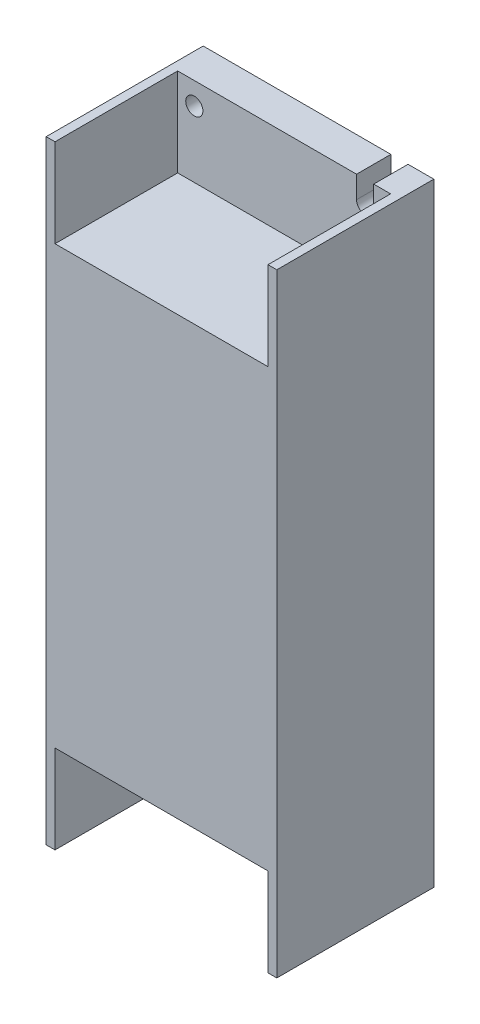
ISO-10303-21;
HEADER;
FILE_DESCRIPTION(('STEP AP214'),'2;1');
FILE_NAME('part.step','',(''),(''),'','','');
FILE_SCHEMA(('AUTOMOTIVE_DESIGN { 1 0 10303 214 1 1 1 1 }'));
ENDSEC;
DATA;
#1=APPLICATION_CONTEXT('core data for automotive mechanical design processes');
#2=APPLICATION_PROTOCOL_DEFINITION('international standard','automotive_design',2000,#1);
#3=PRODUCT_CONTEXT('',#1,'mechanical');
#4=PRODUCT('Part','Part','',(#3));
#5=PRODUCT_RELATED_PRODUCT_CATEGORY('part','',(#4));
#6=PRODUCT_DEFINITION_FORMATION('','',#4);
#7=PRODUCT_DEFINITION_CONTEXT('part definition',#1,'design');
#8=PRODUCT_DEFINITION('design','',#6,#7);
#9=PRODUCT_DEFINITION_SHAPE('','',#8);
#10=(LENGTH_UNIT() NAMED_UNIT(*) SI_UNIT(.MILLI.,.METRE.));
#11=(NAMED_UNIT(*) PLANE_ANGLE_UNIT() SI_UNIT($,.RADIAN.));
#12=(NAMED_UNIT(*) SI_UNIT($,.STERADIAN.) SOLID_ANGLE_UNIT());
#13=UNCERTAINTY_MEASURE_WITH_UNIT(LENGTH_MEASURE(1.E-05),#10,'distance_accuracy_value','');
#14=(GEOMETRIC_REPRESENTATION_CONTEXT(3) GLOBAL_UNCERTAINTY_ASSIGNED_CONTEXT((#13)) GLOBAL_UNIT_ASSIGNED_CONTEXT((#10,
#11,#12)) REPRESENTATION_CONTEXT('',''));
#15=CARTESIAN_POINT('',(0.,0.,0.));
#16=DIRECTION('',(0.,0.,1.));
#17=DIRECTION('',(1.,0.,0.));
#18=AXIS2_PLACEMENT_3D('',#15,#16,#17);
#19=CARTESIAN_POINT('',(-23.5,-62.5,32.));
#20=DIRECTION('',(0.,1.,0.));
#21=DIRECTION('',(0.,0.,1.));
#22=AXIS2_PLACEMENT_3D('',#19,#20,#21);
#23=PLANE('',#22);
#24=DIRECTION('',(0.,0.,1.));
#25=VECTOR('',#24,1.);
#26=CARTESIAN_POINT('',(-21.7,-62.5,-46.9846783536931));
#27=LINE('',#26,#25);
#28=CARTESIAN_POINT('',(-21.7,-62.5,7.));
#29=VERTEX_POINT('',#28);
#30=CARTESIAN_POINT('',(-21.7,-62.5,32.));
#31=VERTEX_POINT('',#30);
#32=EDGE_CURVE('E177',#29,#31,#27,.T.);
#33=ORIENTED_EDGE('',*,*,#32,.T.);
#34=DIRECTION('',(1.,0.,0.));
#35=VECTOR('',#34,1.);
#36=CARTESIAN_POINT('',(-23.5,-62.5,32.));
#37=LINE('',#36,#35);
#38=CARTESIAN_POINT('',(-23.5,-62.5,32.));
#39=VERTEX_POINT('',#38);
#40=EDGE_CURVE('E190',#39,#31,#37,.T.);
#41=ORIENTED_EDGE('',*,*,#40,.F.);
#42=DIRECTION('',(0.,0.,-1.));
#43=VECTOR('',#42,1.);
#44=CARTESIAN_POINT('',(-23.5,-62.5,32.));
#45=LINE('',#44,#43);
#46=CARTESIAN_POINT('',(-23.5,-62.5,0.));
#47=VERTEX_POINT('',#46);
#48=EDGE_CURVE('E204',#39,#47,#45,.T.);
#49=ORIENTED_EDGE('',*,*,#48,.T.);
#50=DIRECTION('',(1.,0.,0.));
#51=VECTOR('',#50,1.);
#52=CARTESIAN_POINT('',(-23.5,-62.5,0.));
#53=LINE('',#52,#51);
#54=CARTESIAN_POINT('',(-18.2499999999996,-62.5000000000001,0.));
#55=VERTEX_POINT('',#54);
#56=EDGE_CURVE('E220',#47,#55,#53,.T.);
#57=ORIENTED_EDGE('',*,*,#56,.T.);
#58=DIRECTION('',(0.,0.,-1.));
#59=VECTOR('',#58,1.);
#60=CARTESIAN_POINT('',(-18.2499999999996,-62.5000000000001,10.));
#61=LINE('',#60,#59);
#62=CARTESIAN_POINT('',(-18.2499999999996,-62.5,7.));
#63=VERTEX_POINT('',#62);
#64=EDGE_CURVE('E325',#63,#55,#61,.T.);
#65=ORIENTED_EDGE('',*,*,#64,.F.);
#66=DIRECTION('',(1.,0.,0.));
#67=VECTOR('',#66,1.);
#68=CARTESIAN_POINT('',(-21.7,-62.5,7.));
#69=LINE('',#68,#67);
#70=EDGE_CURVE('E192',#29,#63,#69,.T.);
#71=ORIENTED_EDGE('',*,*,#70,.F.);
#72=EDGE_LOOP('',(#33,#41,#49,#57,#65,#71));
#73=FACE_BOUND('',#72,.T.);
#74=ADVANCED_FACE('F37',(#73),#23,.F.);
#75=DIRECTION('',(0.,0.,1.));
#76=VECTOR('',#75,1.);
#77=CARTESIAN_POINT('',(21.7,-62.5,-46.9846783536931));
#78=LINE('',#77,#76);
#79=CARTESIAN_POINT('',(21.7,-62.5,7.));
#80=VERTEX_POINT('',#79);
#81=CARTESIAN_POINT('',(21.7,-62.5,32.));
#82=VERTEX_POINT('',#81);
#83=EDGE_CURVE('E193',#80,#82,#78,.T.);
#84=ORIENTED_EDGE('',*,*,#83,.F.);
#85=CARTESIAN_POINT('',(-14.7499999999996,-62.5,7.));
#86=VERTEX_POINT('',#85);
#87=EDGE_CURVE('E490',#86,#80,#69,.T.);
#88=ORIENTED_EDGE('',*,*,#87,.F.);
#89=DIRECTION('',(0.,0.,-1.));
#90=VECTOR('',#89,1.);
#91=CARTESIAN_POINT('',(-14.7499999999996,-62.5000000000001,10.));
#92=LINE('',#91,#90);
#93=CARTESIAN_POINT('',(-14.7499999999996,-62.5000000000001,0.));
#94=VERTEX_POINT('',#93);
#95=EDGE_CURVE('E317',#86,#94,#92,.T.);
#96=ORIENTED_EDGE('',*,*,#95,.T.);
#97=CARTESIAN_POINT('',(23.5,-62.5,0.));
#98=VERTEX_POINT('',#97);
#99=EDGE_CURVE('E219',#94,#98,#53,.T.);
#100=ORIENTED_EDGE('',*,*,#99,.T.);
#101=DIRECTION('',(0.,0.,-1.));
#102=VECTOR('',#101,1.);
#103=CARTESIAN_POINT('',(23.5,-62.5,32.));
#104=LINE('',#103,#102);
#105=CARTESIAN_POINT('',(23.5,-62.5,32.));
#106=VERTEX_POINT('',#105);
#107=EDGE_CURVE('E200',#106,#98,#104,.T.);
#108=ORIENTED_EDGE('',*,*,#107,.F.);
#109=EDGE_CURVE('E201',#82,#106,#37,.T.);
#110=ORIENTED_EDGE('',*,*,#109,.F.);
#111=EDGE_LOOP('',(#84,#88,#96,#100,#108,#110));
#112=FACE_BOUND('',#111,.T.);
#113=ADVANCED_FACE('F361',(#112),#23,.F.);
#114=CARTESIAN_POINT('',(0.,0.,32.));
#115=DIRECTION('',(0.,0.,1.));
#116=DIRECTION('',(1.,0.,0.));
#117=AXIS2_PLACEMENT_3D('',#114,#115,#116);
#118=PLANE('',#117);
#119=DIRECTION('',(1.,0.,0.));
#120=VECTOR('',#119,1.);
#121=CARTESIAN_POINT('',(-21.7,-44.5,32.));
#122=LINE('',#121,#120);
#123=CARTESIAN_POINT('',(-21.7,-44.5,32.));
#124=VERTEX_POINT('',#123);
#125=CARTESIAN_POINT('',(21.7,-44.5,32.));
#126=VERTEX_POINT('',#125);
#127=EDGE_CURVE('E194',#124,#126,#122,.T.);
#128=ORIENTED_EDGE('',*,*,#127,.T.);
#129=DIRECTION('',(0.,-1.,0.));
#130=VECTOR('',#129,1.);
#131=CARTESIAN_POINT('',(21.7,-62.5,32.));
#132=LINE('',#131,#130);
#133=EDGE_CURVE('E185',#126,#82,#132,.T.);
#134=ORIENTED_EDGE('',*,*,#133,.T.);
#135=ORIENTED_EDGE('',*,*,#109,.T.);
#136=DIRECTION('',(0.,1.,0.));
#137=VECTOR('',#136,1.);
#138=CARTESIAN_POINT('',(23.5,62.5,32.));
#139=LINE('',#138,#137);
#140=CARTESIAN_POINT('',(23.5,62.5,32.));
#141=VERTEX_POINT('',#140);
#142=EDGE_CURVE('E222',#106,#141,#139,.T.);
#143=ORIENTED_EDGE('',*,*,#142,.T.);
#144=DIRECTION('',(-1.,0.,0.));
#145=VECTOR('',#144,1.);
#146=CARTESIAN_POINT('',(-23.5,62.5,32.));
#147=LINE('',#146,#145);
#148=CARTESIAN_POINT('',(21.7,62.5,32.));
#149=VERTEX_POINT('',#148);
#150=EDGE_CURVE('E289',#141,#149,#147,.T.);
#151=ORIENTED_EDGE('',*,*,#150,.T.);
#152=DIRECTION('',(0.,1.,0.));
#153=VECTOR('',#152,1.);
#154=CARTESIAN_POINT('',(21.7,62.5,32.));
#155=LINE('',#154,#153);
#156=CARTESIAN_POINT('',(21.7,44.5,32.));
#157=VERTEX_POINT('',#156);
#158=EDGE_CURVE('E276',#157,#149,#155,.T.);
#159=ORIENTED_EDGE('',*,*,#158,.F.);
#160=DIRECTION('',(1.,0.,0.));
#161=VECTOR('',#160,1.);
#162=CARTESIAN_POINT('',(-21.7,44.5,32.));
#163=LINE('',#162,#161);
#164=CARTESIAN_POINT('',(-21.7,44.5,32.));
#165=VERTEX_POINT('',#164);
#166=EDGE_CURVE('E273',#165,#157,#163,.T.);
#167=ORIENTED_EDGE('',*,*,#166,.F.);
#168=DIRECTION('',(0.,-1.,0.));
#169=VECTOR('',#168,1.);
#170=CARTESIAN_POINT('',(-21.7,62.5,32.));
#171=LINE('',#170,#169);
#172=CARTESIAN_POINT('',(-21.7,62.5,32.));
#173=VERTEX_POINT('',#172);
#174=EDGE_CURVE('E235',#173,#165,#171,.T.);
#175=ORIENTED_EDGE('',*,*,#174,.F.);
#176=CARTESIAN_POINT('',(-23.5,62.5,32.));
#177=VERTEX_POINT('',#176);
#178=EDGE_CURVE('E288',#173,#177,#147,.T.);
#179=ORIENTED_EDGE('',*,*,#178,.T.);
#180=DIRECTION('',(0.,-1.,0.));
#181=VECTOR('',#180,1.);
#182=CARTESIAN_POINT('',(-23.5,62.5,32.));
#183=LINE('',#182,#181);
#184=EDGE_CURVE('E198',#177,#39,#183,.T.);
#185=ORIENTED_EDGE('',*,*,#184,.T.);
#186=ORIENTED_EDGE('',*,*,#40,.T.);
#187=DIRECTION('',(0.,1.,0.));
#188=VECTOR('',#187,1.);
#189=CARTESIAN_POINT('',(-21.7,-62.5,32.));
#190=LINE('',#189,#188);
#191=EDGE_CURVE('E174',#31,#124,#190,.T.);
#192=ORIENTED_EDGE('',*,*,#191,.T.);
#193=EDGE_LOOP('',(#128,#134,#135,#143,#151,#159,#167,#175,#179,#185,#186,#192));
#194=FACE_BOUND('',#193,.T.);
#195=ADVANCED_FACE('F196',(#194),#118,.T.);
#196=CARTESIAN_POINT('',(18.3126116640154,-57.9999999999999,10.));
#197=DIRECTION('',(0.,0.,-1.));
#198=DIRECTION('',(-1.,0.,0.));
#199=AXIS2_PLACEMENT_3D('',#196,#197,#198);
#200=CYLINDRICAL_SURFACE('',#199,1.75);
#201=CARTESIAN_POINT('',(18.3126116640154,-57.9999999999999,0.));
#202=DIRECTION('',(0.,0.,-1.));
#203=DIRECTION('',(-1.,0.,0.));
#204=AXIS2_PLACEMENT_3D('',#201,#202,#203);
#205=CIRCLE('',#204,1.75);
#206=CARTESIAN_POINT('',(16.5626116640154,-57.9999999999999,0.));
#207=VERTEX_POINT('',#206);
#208=EDGE_CURVE('E324',#207,#207,#205,.T.);
#209=ORIENTED_EDGE('',*,*,#208,.T.);
#210=EDGE_LOOP('',(#209));
#211=FACE_BOUND('',#210,.T.);
#212=CARTESIAN_POINT('',(18.3126116640154,-57.9999999999999,7.));
#213=DIRECTION('',(0.,0.,1.));
#214=DIRECTION('',(1.,0.,0.));
#215=AXIS2_PLACEMENT_3D('',#212,#213,#214);
#216=CIRCLE('',#215,1.75);
#217=CARTESIAN_POINT('',(20.0626116640154,-57.9999999999999,7.));
#218=VERTEX_POINT('',#217);
#219=EDGE_CURVE('E499',#218,#218,#216,.F.);
#220=ORIENTED_EDGE('',*,*,#219,.F.);
#221=EDGE_LOOP('',(#220));
#222=FACE_BOUND('',#221,.T.);
#223=ADVANCED_FACE('F387',(#211,#222),#200,.F.);
#224=CARTESIAN_POINT('',(-16.4999999999996,-58.0000000000001,10.));
#225=DIRECTION('',(0.,0.,-1.));
#226=DIRECTION('',(-1.,0.,0.));
#227=AXIS2_PLACEMENT_3D('',#224,#225,#226);
#228=CYLINDRICAL_SURFACE('',#227,1.75);
#229=CARTESIAN_POINT('',(-16.4999999999996,-58.0000000000001,7.));
#230=DIRECTION('',(0.,0.,1.));
#231=DIRECTION('',(1.,0.,0.));
#232=AXIS2_PLACEMENT_3D('',#229,#230,#231);
#233=CIRCLE('',#232,1.75);
#234=CARTESIAN_POINT('',(-18.2499999999996,-58.0000000000001,7.));
#235=VERTEX_POINT('',#234);
#236=CARTESIAN_POINT('',(-14.7499999999996,-58.0000000000001,7.));
#237=VERTEX_POINT('',#236);
#238=EDGE_CURVE('E51',#235,#237,#233,.F.);
#239=ORIENTED_EDGE('',*,*,#238,.F.);
#240=DIRECTION('',(0.,0.,-1.));
#241=VECTOR('',#240,1.);
#242=CARTESIAN_POINT('',(-18.2499999999996,-58.0000000000001,10.));
#243=LINE('',#242,#241);
#244=CARTESIAN_POINT('',(-18.2499999999996,-58.0000000000001,0.));
#245=VERTEX_POINT('',#244);
#246=EDGE_CURVE('E322',#235,#245,#243,.T.);
#247=ORIENTED_EDGE('',*,*,#246,.T.);
#248=CARTESIAN_POINT('',(-16.4999999999996,-58.0000000000001,0.));
#249=DIRECTION('',(0.,0.,-1.));
#250=DIRECTION('',(1.,0.,0.));
#251=AXIS2_PLACEMENT_3D('',#248,#249,#250);
#252=CIRCLE('',#251,1.75);
#253=CARTESIAN_POINT('',(-14.7499999999996,-58.0000000000001,0.));
#254=VERTEX_POINT('',#253);
#255=EDGE_CURVE('E312',#245,#254,#252,.T.);
#256=ORIENTED_EDGE('',*,*,#255,.T.);
#257=DIRECTION('',(0.,0.,-1.));
#258=VECTOR('',#257,1.);
#259=CARTESIAN_POINT('',(-14.7499999999996,-58.0000000000001,10.));
#260=LINE('',#259,#258);
#261=EDGE_CURVE('E58',#237,#254,#260,.T.);
#262=ORIENTED_EDGE('',*,*,#261,.F.);
#263=EDGE_LOOP('',(#239,#247,#256,#262));
#264=FACE_BOUND('',#263,.T.);
#265=ADVANCED_FACE('F381',(#264),#228,.F.);
#266=CARTESIAN_POINT('',(-18.2499999999996,-62.5000000000001,10.));
#267=DIRECTION('',(-1.,0.,0.));
#268=DIRECTION('',(0.,-1.,0.));
#269=AXIS2_PLACEMENT_3D('',#266,#267,#268);
#270=PLANE('',#269);
#271=DIRECTION('',(0.,1.,0.));
#272=VECTOR('',#271,1.);
#273=CARTESIAN_POINT('',(-18.2499999999996,-62.5000000000001,7.));
#274=LINE('',#273,#272);
#275=EDGE_CURVE('E496',#63,#235,#274,.T.);
#276=ORIENTED_EDGE('',*,*,#275,.F.);
#277=ORIENTED_EDGE('',*,*,#64,.T.);
#278=DIRECTION('',(0.,1.,0.));
#279=VECTOR('',#278,1.);
#280=CARTESIAN_POINT('',(-18.2499999999996,-62.5000000000001,0.));
#281=LINE('',#280,#279);
#282=EDGE_CURVE('E310',#55,#245,#281,.T.);
#283=ORIENTED_EDGE('',*,*,#282,.T.);
#284=ORIENTED_EDGE('',*,*,#246,.F.);
#285=EDGE_LOOP('',(#276,#277,#283,#284));
#286=FACE_BOUND('',#285,.T.);
#287=ADVANCED_FACE('F376',(#286),#270,.F.);
#288=CARTESIAN_POINT('',(-14.7499999999996,-58.0000000000001,10.));
#289=DIRECTION('',(1.,0.,0.));
#290=DIRECTION('',(0.,1.,0.));
#291=AXIS2_PLACEMENT_3D('',#288,#289,#290);
#292=PLANE('',#291);
#293=DIRECTION('',(0.,-1.,0.));
#294=VECTOR('',#293,1.);
#295=CARTESIAN_POINT('',(-14.7499999999996,-58.0000000000001,7.));
#296=LINE('',#295,#294);
#297=EDGE_CURVE('E12',#237,#86,#296,.T.);
#298=ORIENTED_EDGE('',*,*,#297,.F.);
#299=ORIENTED_EDGE('',*,*,#261,.T.);
#300=DIRECTION('',(0.,-1.,0.));
#301=VECTOR('',#300,1.);
#302=CARTESIAN_POINT('',(-14.7499999999996,-58.0000000000001,0.));
#303=LINE('',#302,#301);
#304=EDGE_CURVE('E315',#254,#94,#303,.T.);
#305=ORIENTED_EDGE('',*,*,#304,.T.);
#306=ORIENTED_EDGE('',*,*,#95,.F.);
#307=EDGE_LOOP('',(#298,#299,#305,#306));
#308=FACE_BOUND('',#307,.T.);
#309=ADVANCED_FACE('F372',(#308),#292,.F.);
#310=CARTESIAN_POINT('',(-23.5,62.5,32.));
#311=DIRECTION('',(0.,-1.,0.));
#312=DIRECTION('',(0.,0.,-1.));
#313=AXIS2_PLACEMENT_3D('',#310,#311,#312);
#314=PLANE('',#313);
#315=DIRECTION('',(-1.,0.,0.));
#316=VECTOR('',#315,1.);
#317=CARTESIAN_POINT('',(-23.5,62.5,0.));
#318=LINE('',#317,#316);
#319=CARTESIAN_POINT('',(23.5,62.5,0.));
#320=VERTEX_POINT('',#319);
#321=CARTESIAN_POINT('',(18.25,62.5,0.));
#322=VERTEX_POINT('',#321);
#323=EDGE_CURVE('E214',#320,#322,#318,.T.);
#324=ORIENTED_EDGE('',*,*,#323,.T.);
#325=DIRECTION('',(0.,0.,-1.));
#326=VECTOR('',#325,1.);
#327=CARTESIAN_POINT('',(18.25,62.5,10.));
#328=LINE('',#327,#326);
#329=CARTESIAN_POINT('',(18.25,62.5,7.));
#330=VERTEX_POINT('',#329);
#331=EDGE_CURVE('E245',#330,#322,#328,.T.);
#332=ORIENTED_EDGE('',*,*,#331,.F.);
#333=DIRECTION('',(1.,0.,0.));
#334=VECTOR('',#333,1.);
#335=CARTESIAN_POINT('',(-21.7,62.5,7.));
#336=LINE('',#335,#334);
#337=CARTESIAN_POINT('',(21.7,62.5,7.));
#338=VERTEX_POINT('',#337);
#339=EDGE_CURVE('E254',#330,#338,#336,.T.);
#340=ORIENTED_EDGE('',*,*,#339,.T.);
#341=DIRECTION('',(0.,0.,1.));
#342=VECTOR('',#341,1.);
#343=CARTESIAN_POINT('',(21.7,62.5,-46.9846783536931));
#344=LINE('',#343,#342);
#345=EDGE_CURVE('E280',#338,#149,#344,.T.);
#346=ORIENTED_EDGE('',*,*,#345,.T.);
#347=ORIENTED_EDGE('',*,*,#150,.F.);
#348=DIRECTION('',(0.,0.,-1.));
#349=VECTOR('',#348,1.);
#350=CARTESIAN_POINT('',(23.5,62.5,32.));
#351=LINE('',#350,#349);
#352=EDGE_CURVE('E228',#141,#320,#351,.T.);
#353=ORIENTED_EDGE('',*,*,#352,.T.);
#354=EDGE_LOOP('',(#324,#332,#340,#346,#347,#353));
#355=FACE_BOUND('',#354,.T.);
#356=ADVANCED_FACE('F252',(#355),#314,.F.);
#357=CARTESIAN_POINT('',(23.5,62.5,32.));
#358=DIRECTION('',(-1.,0.,0.));
#359=DIRECTION('',(0.,-1.,0.));
#360=AXIS2_PLACEMENT_3D('',#357,#358,#359);
#361=PLANE('',#360);
#362=DIRECTION('',(0.,1.,0.));
#363=VECTOR('',#362,1.);
#364=CARTESIAN_POINT('',(23.5,62.5,0.));
#365=LINE('',#364,#363);
#366=EDGE_CURVE('E209',#98,#320,#365,.T.);
#367=ORIENTED_EDGE('',*,*,#366,.T.);
#368=ORIENTED_EDGE('',*,*,#352,.F.);
#369=ORIENTED_EDGE('',*,*,#142,.F.);
#370=ORIENTED_EDGE('',*,*,#107,.T.);
#371=EDGE_LOOP('',(#367,#368,#369,#370));
#372=FACE_BOUND('',#371,.T.);
#373=ADVANCED_FACE('F39',(#372),#361,.F.);
#374=CARTESIAN_POINT('',(-21.7,62.5,7.));
#375=VERTEX_POINT('',#374);
#376=CARTESIAN_POINT('',(14.75,62.5,7.));
#377=VERTEX_POINT('',#376);
#378=EDGE_CURVE('E263',#375,#377,#336,.T.);
#379=ORIENTED_EDGE('',*,*,#378,.T.);
#380=DIRECTION('',(0.,0.,-1.));
#381=VECTOR('',#380,1.);
#382=CARTESIAN_POINT('',(14.75,62.5,10.));
#383=LINE('',#382,#381);
#384=CARTESIAN_POINT('',(14.75,62.5,0.));
#385=VERTEX_POINT('',#384);
#386=EDGE_CURVE('E256',#377,#385,#383,.T.);
#387=ORIENTED_EDGE('',*,*,#386,.T.);
#388=CARTESIAN_POINT('',(-23.5,62.5,0.));
#389=VERTEX_POINT('',#388);
#390=EDGE_CURVE('E212',#385,#389,#318,.T.);
#391=ORIENTED_EDGE('',*,*,#390,.T.);
#392=DIRECTION('',(0.,0.,-1.));
#393=VECTOR('',#392,1.);
#394=CARTESIAN_POINT('',(-23.5,62.5,32.));
#395=LINE('',#394,#393);
#396=EDGE_CURVE('E225',#177,#389,#395,.T.);
#397=ORIENTED_EDGE('',*,*,#396,.F.);
#398=ORIENTED_EDGE('',*,*,#178,.F.);
#399=DIRECTION('',(0.,0.,1.));
#400=VECTOR('',#399,1.);
#401=CARTESIAN_POINT('',(-21.7,62.5,-46.9846783536931));
#402=LINE('',#401,#400);
#403=EDGE_CURVE('E267',#375,#173,#402,.T.);
#404=ORIENTED_EDGE('',*,*,#403,.F.);
#405=EDGE_LOOP('',(#379,#387,#391,#397,#398,#404));
#406=FACE_BOUND('',#405,.T.);
#407=ADVANCED_FACE('F298',(#406),#314,.F.);
#408=CARTESIAN_POINT('',(-23.5,62.5,32.));
#409=DIRECTION('',(1.,0.,0.));
#410=DIRECTION('',(0.,1.,0.));
#411=AXIS2_PLACEMENT_3D('',#408,#409,#410);
#412=PLANE('',#411);
#413=DIRECTION('',(0.,-1.,0.));
#414=VECTOR('',#413,1.);
#415=CARTESIAN_POINT('',(-23.5,62.5,0.));
#416=LINE('',#415,#414);
#417=EDGE_CURVE('E217',#389,#47,#416,.T.);
#418=ORIENTED_EDGE('',*,*,#417,.T.);
#419=ORIENTED_EDGE('',*,*,#48,.F.);
#420=ORIENTED_EDGE('',*,*,#184,.F.);
#421=ORIENTED_EDGE('',*,*,#396,.T.);
#422=EDGE_LOOP('',(#418,#419,#420,#421));
#423=FACE_BOUND('',#422,.T.);
#424=ADVANCED_FACE('F303',(#423),#412,.F.);
#425=CARTESIAN_POINT('',(0.,0.,0.));
#426=DIRECTION('',(0.,0.,1.));
#427=DIRECTION('',(1.,0.,0.));
#428=AXIS2_PLACEMENT_3D('',#425,#426,#427);
#429=PLANE('',#428);
#430=ORIENTED_EDGE('',*,*,#208,.F.);
#431=EDGE_LOOP('',(#430));
#432=FACE_BOUND('',#431,.T.);
#433=CARTESIAN_POINT('',(-18.312611664015,58.,0.));
#434=DIRECTION('',(0.,0.,-1.));
#435=DIRECTION('',(-1.,0.,0.));
#436=AXIS2_PLACEMENT_3D('',#433,#434,#435);
#437=CIRCLE('',#436,1.75);
#438=CARTESIAN_POINT('',(-20.062611664015,58.,0.));
#439=VERTEX_POINT('',#438);
#440=EDGE_CURVE('E236',#439,#439,#437,.T.);
#441=ORIENTED_EDGE('',*,*,#440,.F.);
#442=EDGE_LOOP('',(#441));
#443=FACE_BOUND('',#442,.T.);
#444=ORIENTED_EDGE('',*,*,#255,.F.);
#445=ORIENTED_EDGE('',*,*,#282,.F.);
#446=ORIENTED_EDGE('',*,*,#56,.F.);
#447=ORIENTED_EDGE('',*,*,#417,.F.);
#448=ORIENTED_EDGE('',*,*,#390,.F.);
#449=DIRECTION('',(0.,1.,0.));
#450=VECTOR('',#449,1.);
#451=CARTESIAN_POINT('',(14.75,58.,0.));
#452=LINE('',#451,#450);
#453=CARTESIAN_POINT('',(14.75,58.,0.));
#454=VERTEX_POINT('',#453);
#455=EDGE_CURVE('E333',#454,#385,#452,.T.);
#456=ORIENTED_EDGE('',*,*,#455,.F.);
#457=CARTESIAN_POINT('',(16.5,58.,0.));
#458=DIRECTION('',(0.,0.,-1.));
#459=DIRECTION('',(1.,0.,0.));
#460=AXIS2_PLACEMENT_3D('',#457,#458,#459);
#461=CIRCLE('',#460,1.75);
#462=CARTESIAN_POINT('',(18.25,58.,0.));
#463=VERTEX_POINT('',#462);
#464=EDGE_CURVE('E330',#463,#454,#461,.T.);
#465=ORIENTED_EDGE('',*,*,#464,.F.);
#466=DIRECTION('',(0.,-1.,0.));
#467=VECTOR('',#466,1.);
#468=CARTESIAN_POINT('',(18.25,62.5,0.));
#469=LINE('',#468,#467);
#470=EDGE_CURVE('E335',#322,#463,#469,.T.);
#471=ORIENTED_EDGE('',*,*,#470,.F.);
#472=ORIENTED_EDGE('',*,*,#323,.F.);
#473=ORIENTED_EDGE('',*,*,#366,.F.);
#474=ORIENTED_EDGE('',*,*,#99,.F.);
#475=ORIENTED_EDGE('',*,*,#304,.F.);
#476=EDGE_LOOP('',(#444,#445,#446,#447,#448,#456,#465,#471,#472,#473,#474,#475));
#477=FACE_BOUND('',#476,.T.);
#478=ADVANCED_FACE('F308',(#432,#443,#477),#429,.F.);
#479=CARTESIAN_POINT('',(-21.7,62.5,-46.9846783536931));
#480=DIRECTION('',(-1.,0.,0.));
#481=DIRECTION('',(0.,0.,1.));
#482=AXIS2_PLACEMENT_3D('',#479,#480,#481);
#483=PLANE('',#482);
#484=DIRECTION('',(0.,1.,0.));
#485=VECTOR('',#484,1.);
#486=CARTESIAN_POINT('',(-21.7,62.5,7.));
#487=LINE('',#486,#485);
#488=CARTESIAN_POINT('',(-21.7,44.5,7.));
#489=VERTEX_POINT('',#488);
#490=EDGE_CURVE('E266',#489,#375,#487,.T.);
#491=ORIENTED_EDGE('',*,*,#490,.T.);
#492=ORIENTED_EDGE('',*,*,#403,.T.);
#493=ORIENTED_EDGE('',*,*,#174,.T.);
#494=DIRECTION('',(0.,0.,1.));
#495=VECTOR('',#494,1.);
#496=CARTESIAN_POINT('',(-21.7,44.5,-46.9846783536931));
#497=LINE('',#496,#495);
#498=EDGE_CURVE('E278',#489,#165,#497,.T.);
#499=ORIENTED_EDGE('',*,*,#498,.F.);
#500=EDGE_LOOP('',(#491,#492,#493,#499));
#501=FACE_BOUND('',#500,.T.);
#502=ADVANCED_FACE('F346',(#501),#483,.F.);
#503=CARTESIAN_POINT('',(21.7,62.5,-46.9846783536931));
#504=DIRECTION('',(1.,0.,0.));
#505=DIRECTION('',(0.,1.,0.));
#506=AXIS2_PLACEMENT_3D('',#503,#504,#505);
#507=PLANE('',#506);
#508=DIRECTION('',(0.,-1.,0.));
#509=VECTOR('',#508,1.);
#510=CARTESIAN_POINT('',(21.7,62.5,7.));
#511=LINE('',#510,#509);
#512=CARTESIAN_POINT('',(21.7,44.5,7.));
#513=VERTEX_POINT('',#512);
#514=EDGE_CURVE('E261',#338,#513,#511,.T.);
#515=ORIENTED_EDGE('',*,*,#514,.T.);
#516=DIRECTION('',(0.,0.,1.));
#517=VECTOR('',#516,1.);
#518=CARTESIAN_POINT('',(21.7,44.5,-46.9846783536931));
#519=LINE('',#518,#517);
#520=EDGE_CURVE('E282',#513,#157,#519,.T.);
#521=ORIENTED_EDGE('',*,*,#520,.T.);
#522=ORIENTED_EDGE('',*,*,#158,.T.);
#523=ORIENTED_EDGE('',*,*,#345,.F.);
#524=EDGE_LOOP('',(#515,#521,#522,#523));
#525=FACE_BOUND('',#524,.T.);
#526=ADVANCED_FACE('F353',(#525),#507,.F.);
#527=CARTESIAN_POINT('',(-21.7,44.5,-46.9846783536931));
#528=DIRECTION('',(0.,-1.,0.));
#529=DIRECTION('',(0.,0.,-1.));
#530=AXIS2_PLACEMENT_3D('',#527,#528,#529);
#531=PLANE('',#530);
#532=DIRECTION('',(-1.,0.,0.));
#533=VECTOR('',#532,1.);
#534=CARTESIAN_POINT('',(-21.7,44.5,7.));
#535=LINE('',#534,#533);
#536=EDGE_CURVE('E213',#513,#489,#535,.T.);
#537=ORIENTED_EDGE('',*,*,#536,.T.);
#538=ORIENTED_EDGE('',*,*,#498,.T.);
#539=ORIENTED_EDGE('',*,*,#166,.T.);
#540=ORIENTED_EDGE('',*,*,#520,.F.);
#541=EDGE_LOOP('',(#537,#538,#539,#540));
#542=FACE_BOUND('',#541,.T.);
#543=ADVANCED_FACE('F408',(#542),#531,.F.);
#544=CARTESIAN_POINT('',(0.,0.,7.));
#545=DIRECTION('',(0.,0.,1.));
#546=DIRECTION('',(1.,0.,0.));
#547=AXIS2_PLACEMENT_3D('',#544,#545,#546);
#548=PLANE('',#547);
#549=DIRECTION('',(0.,1.,0.));
#550=VECTOR('',#549,1.);
#551=CARTESIAN_POINT('',(18.25,0.,7.));
#552=LINE('',#551,#550);
#553=CARTESIAN_POINT('',(18.25,58.,7.));
#554=VERTEX_POINT('',#553);
#555=EDGE_CURVE('E45',#554,#330,#552,.T.);
#556=ORIENTED_EDGE('',*,*,#555,.F.);
#557=CARTESIAN_POINT('',(16.5,58.,7.));
#558=DIRECTION('',(0.,0.,1.));
#559=DIRECTION('',(1.,0.,0.));
#560=AXIS2_PLACEMENT_3D('',#557,#558,#559);
#561=CIRCLE('',#560,1.75);
#562=CARTESIAN_POINT('',(14.75,58.,7.));
#563=VERTEX_POINT('',#562);
#564=EDGE_CURVE('E238',#563,#554,#561,.T.);
#565=ORIENTED_EDGE('',*,*,#564,.F.);
#566=DIRECTION('',(0.,-1.,0.));
#567=VECTOR('',#566,1.);
#568=CARTESIAN_POINT('',(14.75,0.,7.));
#569=LINE('',#568,#567);
#570=EDGE_CURVE('E231',#377,#563,#569,.T.);
#571=ORIENTED_EDGE('',*,*,#570,.F.);
#572=ORIENTED_EDGE('',*,*,#378,.F.);
#573=ORIENTED_EDGE('',*,*,#490,.F.);
#574=ORIENTED_EDGE('',*,*,#536,.F.);
#575=ORIENTED_EDGE('',*,*,#514,.F.);
#576=ORIENTED_EDGE('',*,*,#339,.F.);
#577=EDGE_LOOP('',(#556,#565,#571,#572,#573,#574,#575,#576));
#578=FACE_BOUND('',#577,.T.);
#579=CARTESIAN_POINT('',(-18.312611664015,58.,7.));
#580=DIRECTION('',(0.,0.,1.));
#581=DIRECTION('',(1.,0.,0.));
#582=AXIS2_PLACEMENT_3D('',#579,#580,#581);
#583=CIRCLE('',#582,1.75);
#584=CARTESIAN_POINT('',(-16.562611664015,58.,7.));
#585=VERTEX_POINT('',#584);
#586=EDGE_CURVE('E232',#585,#585,#583,.T.);
#587=ORIENTED_EDGE('',*,*,#586,.F.);
#588=EDGE_LOOP('',(#587));
#589=FACE_BOUND('',#588,.T.);
#590=ADVANCED_FACE('F258',(#578,#589),#548,.T.);
#591=CARTESIAN_POINT('',(-18.312611664015,58.,10.));
#592=DIRECTION('',(0.,0.,-1.));
#593=DIRECTION('',(-1.,0.,0.));
#594=AXIS2_PLACEMENT_3D('',#591,#592,#593);
#595=CYLINDRICAL_SURFACE('',#594,1.75);
#596=ORIENTED_EDGE('',*,*,#586,.T.);
#597=EDGE_LOOP('',(#596));
#598=FACE_BOUND('',#597,.T.);
#599=ORIENTED_EDGE('',*,*,#440,.T.);
#600=EDGE_LOOP('',(#599));
#601=FACE_BOUND('',#600,.T.);
#602=ADVANCED_FACE('F343',(#598,#601),#595,.F.);
#603=CARTESIAN_POINT('',(16.5,58.,10.));
#604=DIRECTION('',(0.,0.,-1.));
#605=DIRECTION('',(-1.,0.,0.));
#606=AXIS2_PLACEMENT_3D('',#603,#604,#605);
#607=CYLINDRICAL_SURFACE('',#606,1.75);
#608=ORIENTED_EDGE('',*,*,#564,.T.);
#609=DIRECTION('',(0.,0.,-1.));
#610=VECTOR('',#609,1.);
#611=CARTESIAN_POINT('',(18.25,58.,10.));
#612=LINE('',#611,#610);
#613=EDGE_CURVE('E247',#554,#463,#612,.T.);
#614=ORIENTED_EDGE('',*,*,#613,.T.);
#615=ORIENTED_EDGE('',*,*,#464,.T.);
#616=DIRECTION('',(0.,0.,-1.));
#617=VECTOR('',#616,1.);
#618=CARTESIAN_POINT('',(14.75,58.,10.));
#619=LINE('',#618,#617);
#620=EDGE_CURVE('E337',#563,#454,#619,.T.);
#621=ORIENTED_EDGE('',*,*,#620,.F.);
#622=EDGE_LOOP('',(#608,#614,#615,#621));
#623=FACE_BOUND('',#622,.T.);
#624=ADVANCED_FACE('F395',(#623),#607,.F.);
#625=CARTESIAN_POINT('',(18.25,62.5,10.));
#626=DIRECTION('',(1.,0.,0.));
#627=DIRECTION('',(0.,1.,0.));
#628=AXIS2_PLACEMENT_3D('',#625,#626,#627);
#629=PLANE('',#628);
#630=ORIENTED_EDGE('',*,*,#555,.T.);
#631=ORIENTED_EDGE('',*,*,#331,.T.);
#632=ORIENTED_EDGE('',*,*,#470,.T.);
#633=ORIENTED_EDGE('',*,*,#613,.F.);
#634=EDGE_LOOP('',(#630,#631,#632,#633));
#635=FACE_BOUND('',#634,.T.);
#636=ADVANCED_FACE('F243',(#635),#629,.F.);
#637=CARTESIAN_POINT('',(14.75,58.,10.));
#638=DIRECTION('',(-1.,0.,0.));
#639=DIRECTION('',(0.,-1.,0.));
#640=AXIS2_PLACEMENT_3D('',#637,#638,#639);
#641=PLANE('',#640);
#642=ORIENTED_EDGE('',*,*,#570,.T.);
#643=ORIENTED_EDGE('',*,*,#620,.T.);
#644=ORIENTED_EDGE('',*,*,#455,.T.);
#645=ORIENTED_EDGE('',*,*,#386,.F.);
#646=EDGE_LOOP('',(#642,#643,#644,#645));
#647=FACE_BOUND('',#646,.T.);
#648=ADVANCED_FACE('F394',(#647),#641,.F.);
#649=CARTESIAN_POINT('',(0.,0.,7.));
#650=DIRECTION('',(0.,0.,1.));
#651=DIRECTION('',(1.,0.,0.));
#652=AXIS2_PLACEMENT_3D('',#649,#650,#651);
#653=PLANE('',#652);
#654=ORIENTED_EDGE('',*,*,#275,.T.);
#655=ORIENTED_EDGE('',*,*,#238,.T.);
#656=ORIENTED_EDGE('',*,*,#297,.T.);
#657=ORIENTED_EDGE('',*,*,#87,.T.);
#658=DIRECTION('',(0.,1.,0.));
#659=VECTOR('',#658,1.);
#660=CARTESIAN_POINT('',(21.7,-62.5,7.));
#661=LINE('',#660,#659);
#662=CARTESIAN_POINT('',(21.7,-44.5,7.));
#663=VERTEX_POINT('',#662);
#664=EDGE_CURVE('E494',#80,#663,#661,.T.);
#665=ORIENTED_EDGE('',*,*,#664,.T.);
#666=DIRECTION('',(-1.,0.,0.));
#667=VECTOR('',#666,1.);
#668=CARTESIAN_POINT('',(-21.7,-44.5,7.));
#669=LINE('',#668,#667);
#670=CARTESIAN_POINT('',(-21.7,-44.5,7.));
#671=VERTEX_POINT('',#670);
#672=EDGE_CURVE('E480',#663,#671,#669,.T.);
#673=ORIENTED_EDGE('',*,*,#672,.T.);
#674=DIRECTION('',(0.,-1.,0.));
#675=VECTOR('',#674,1.);
#676=CARTESIAN_POINT('',(-21.7,-62.5,7.));
#677=LINE('',#676,#675);
#678=EDGE_CURVE('E497',#671,#29,#677,.T.);
#679=ORIENTED_EDGE('',*,*,#678,.T.);
#680=ORIENTED_EDGE('',*,*,#70,.T.);
#681=EDGE_LOOP('',(#654,#655,#656,#657,#665,#673,#679,#680));
#682=FACE_BOUND('',#681,.T.);
#683=ORIENTED_EDGE('',*,*,#219,.T.);
#684=EDGE_LOOP('',(#683));
#685=FACE_BOUND('',#684,.T.);
#686=ADVANCED_FACE('F398',(#682,#685),#653,.T.);
#687=CARTESIAN_POINT('',(21.7,-62.5,-46.9846783536931));
#688=DIRECTION('',(-1.,0.,0.));
#689=DIRECTION('',(0.,-1.,0.));
#690=AXIS2_PLACEMENT_3D('',#687,#688,#689);
#691=PLANE('',#690);
#692=ORIENTED_EDGE('',*,*,#83,.T.);
#693=ORIENTED_EDGE('',*,*,#133,.F.);
#694=DIRECTION('',(0.,0.,1.));
#695=VECTOR('',#694,1.);
#696=CARTESIAN_POINT('',(21.7,-44.5,-46.9846783536931));
#697=LINE('',#696,#695);
#698=EDGE_CURVE('E477',#663,#126,#697,.T.);
#699=ORIENTED_EDGE('',*,*,#698,.F.);
#700=ORIENTED_EDGE('',*,*,#664,.F.);
#701=EDGE_LOOP('',(#692,#693,#699,#700));
#702=FACE_BOUND('',#701,.T.);
#703=ADVANCED_FACE('F445',(#702),#691,.T.);
#704=CARTESIAN_POINT('',(-21.7,-44.5,-46.9846783536931));
#705=DIRECTION('',(0.,-1.,0.));
#706=DIRECTION('',(0.,0.,-1.));
#707=AXIS2_PLACEMENT_3D('',#704,#705,#706);
#708=PLANE('',#707);
#709=ORIENTED_EDGE('',*,*,#698,.T.);
#710=ORIENTED_EDGE('',*,*,#127,.F.);
#711=DIRECTION('',(0.,0.,1.));
#712=VECTOR('',#711,1.);
#713=CARTESIAN_POINT('',(-21.7,-44.5,-46.9846783536931));
#714=LINE('',#713,#712);
#715=EDGE_CURVE('E180',#671,#124,#714,.T.);
#716=ORIENTED_EDGE('',*,*,#715,.F.);
#717=ORIENTED_EDGE('',*,*,#672,.F.);
#718=EDGE_LOOP('',(#709,#710,#716,#717));
#719=FACE_BOUND('',#718,.T.);
#720=ADVANCED_FACE('F455',(#719),#708,.T.);
#721=CARTESIAN_POINT('',(-21.7,-62.5,-46.9846783536931));
#722=DIRECTION('',(1.,0.,0.));
#723=DIRECTION('',(0.,0.,-1.));
#724=AXIS2_PLACEMENT_3D('',#721,#722,#723);
#725=PLANE('',#724);
#726=ORIENTED_EDGE('',*,*,#715,.T.);
#727=ORIENTED_EDGE('',*,*,#191,.F.);
#728=ORIENTED_EDGE('',*,*,#32,.F.);
#729=ORIENTED_EDGE('',*,*,#678,.F.);
#730=EDGE_LOOP('',(#726,#727,#728,#729));
#731=FACE_BOUND('',#730,.T.);
#732=ADVANCED_FACE('F176',(#731),#725,.T.);
#733=CLOSED_SHELL('',(#74,#113,#195,#223,#265,#287,#309,#356,#373,#407,#424,#478,#502,#526,#543,
#590,#602,#624,#636,#648,#686,#703,#720,#732));
#734=MANIFOLD_SOLID_BREP('B2',#733);
#735=ADVANCED_BREP_SHAPE_REPRESENTATION('',(#18,#734),#14);
#736=SHAPE_DEFINITION_REPRESENTATION(#9,#735);
ENDSEC;
END-ISO-10303-21;
